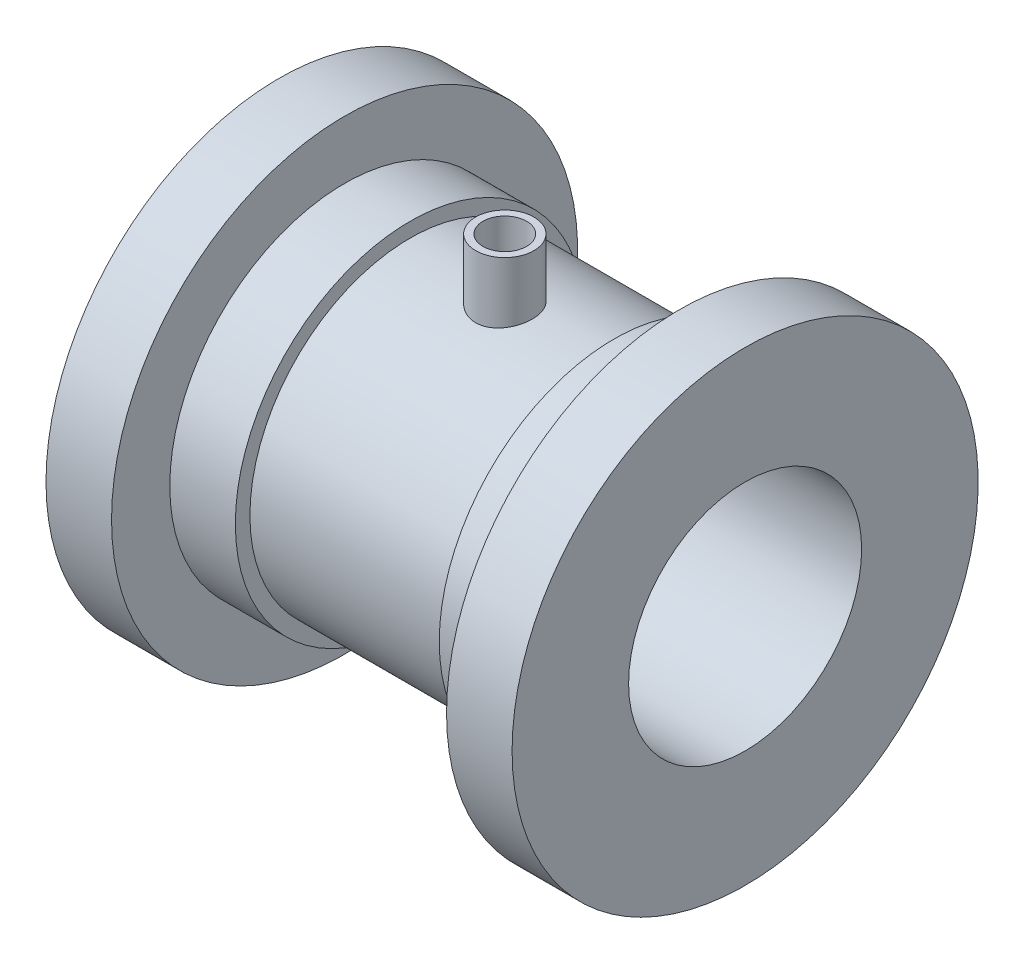
ISO-10303-21;
HEADER;
FILE_DESCRIPTION(('STEP AP214'),'2;1');
FILE_NAME('part.step','',(''),(''),'','','');
FILE_SCHEMA(('AUTOMOTIVE_DESIGN { 1 0 10303 214 1 1 1 1 }'));
ENDSEC;
DATA;
#1=APPLICATION_CONTEXT('core data for automotive mechanical design processes');
#2=APPLICATION_PROTOCOL_DEFINITION('international standard','automotive_design',2000,#1);
#3=PRODUCT_CONTEXT('',#1,'mechanical');
#4=PRODUCT('Part','Part','',(#3));
#5=PRODUCT_RELATED_PRODUCT_CATEGORY('part','',(#4));
#6=PRODUCT_DEFINITION_FORMATION('','',#4);
#7=PRODUCT_DEFINITION_CONTEXT('part definition',#1,'design');
#8=PRODUCT_DEFINITION('design','',#6,#7);
#9=PRODUCT_DEFINITION_SHAPE('','',#8);
#10=(LENGTH_UNIT() NAMED_UNIT(*) SI_UNIT(.MILLI.,.METRE.));
#11=(NAMED_UNIT(*) PLANE_ANGLE_UNIT() SI_UNIT($,.RADIAN.));
#12=(NAMED_UNIT(*) SI_UNIT($,.STERADIAN.) SOLID_ANGLE_UNIT());
#13=UNCERTAINTY_MEASURE_WITH_UNIT(LENGTH_MEASURE(1.E-05),#10,'distance_accuracy_value','');
#14=(GEOMETRIC_REPRESENTATION_CONTEXT(3) GLOBAL_UNCERTAINTY_ASSIGNED_CONTEXT((#13)) GLOBAL_UNIT_ASSIGNED_CONTEXT((#10,
#11,#12)) REPRESENTATION_CONTEXT('',''));
#15=CARTESIAN_POINT('',(0.,0.,0.));
#16=DIRECTION('',(0.,0.,1.));
#17=DIRECTION('',(1.,0.,0.));
#18=AXIS2_PLACEMENT_3D('',#15,#16,#17);
#19=CARTESIAN_POINT('',(0.,16.,0.));
#20=DIRECTION('',(1.,0.,0.));
#21=DIRECTION('',(0.,0.,-1.));
#22=AXIS2_PLACEMENT_3D('',#19,#20,#21);
#23=PLANE('',#22);
#24=CARTESIAN_POINT('',(0.,0.,0.));
#25=DIRECTION('',(-1.,0.,0.));
#26=DIRECTION('',(0.,0.,1.));
#27=AXIS2_PLACEMENT_3D('',#24,#25,#26);
#28=CIRCLE('',#27,16.);
#29=CARTESIAN_POINT('',(0.,0.,16.));
#30=VERTEX_POINT('',#29);
#31=EDGE_CURVE('E94',#30,#30,#28,.T.);
#32=ORIENTED_EDGE('',*,*,#31,.F.);
#33=EDGE_LOOP('',(#32));
#34=FACE_BOUND('',#33,.T.);
#35=CARTESIAN_POINT('',(0.,0.,0.));
#36=DIRECTION('',(-1.,0.,0.));
#37=DIRECTION('',(0.,0.,1.));
#38=AXIS2_PLACEMENT_3D('',#35,#36,#37);
#39=CIRCLE('',#38,32.);
#40=CARTESIAN_POINT('',(0.,0.,32.));
#41=VERTEX_POINT('',#40);
#42=EDGE_CURVE('E10',#41,#41,#39,.T.);
#43=ORIENTED_EDGE('',*,*,#42,.T.);
#44=EDGE_LOOP('',(#43));
#45=FACE_BOUND('',#44,.T.);
#46=ADVANCED_FACE('F43',(#34,#45),#23,.F.);
#47=CARTESIAN_POINT('',(0.,0.,0.));
#48=DIRECTION('',(-1.,0.,0.));
#49=DIRECTION('',(0.,0.,1.));
#50=AXIS2_PLACEMENT_3D('',#47,#48,#49);
#51=CYLINDRICAL_SURFACE('',#50,32.);
#52=ORIENTED_EDGE('',*,*,#42,.F.);
#53=EDGE_LOOP('',(#52));
#54=FACE_BOUND('',#53,.T.);
#55=CARTESIAN_POINT('',(9.,0.,0.));
#56=DIRECTION('',(-1.,0.,0.));
#57=DIRECTION('',(0.,0.,1.));
#58=AXIS2_PLACEMENT_3D('',#55,#56,#57);
#59=CIRCLE('',#58,32.);
#60=CARTESIAN_POINT('',(9.,0.,32.));
#61=VERTEX_POINT('',#60);
#62=EDGE_CURVE('E50',#61,#61,#59,.T.);
#63=ORIENTED_EDGE('',*,*,#62,.T.);
#64=EDGE_LOOP('',(#63));
#65=FACE_BOUND('',#64,.T.);
#66=ADVANCED_FACE('F183',(#54,#65),#51,.T.);
#67=CARTESIAN_POINT('',(9.,32.,0.));
#68=DIRECTION('',(-1.,0.,0.));
#69=DIRECTION('',(0.,0.,1.));
#70=AXIS2_PLACEMENT_3D('',#67,#68,#69);
#71=PLANE('',#70);
#72=ORIENTED_EDGE('',*,*,#62,.F.);
#73=EDGE_LOOP('',(#72));
#74=FACE_BOUND('',#73,.T.);
#75=CARTESIAN_POINT('',(9.,0.,0.));
#76=DIRECTION('',(-1.,0.,0.));
#77=DIRECTION('',(0.,0.,1.));
#78=AXIS2_PLACEMENT_3D('',#75,#76,#77);
#79=CIRCLE('',#78,24.);
#80=CARTESIAN_POINT('',(9.,0.,24.));
#81=VERTEX_POINT('',#80);
#82=EDGE_CURVE('E55',#81,#81,#79,.T.);
#83=ORIENTED_EDGE('',*,*,#82,.T.);
#84=EDGE_LOOP('',(#83));
#85=FACE_BOUND('',#84,.T.);
#86=ADVANCED_FACE('F180',(#74,#85),#71,.F.);
#87=CARTESIAN_POINT('',(0.,0.,0.));
#88=DIRECTION('',(-1.,0.,0.));
#89=DIRECTION('',(0.,0.,1.));
#90=AXIS2_PLACEMENT_3D('',#87,#88,#89);
#91=CYLINDRICAL_SURFACE('',#90,24.);
#92=ORIENTED_EDGE('',*,*,#82,.F.);
#93=EDGE_LOOP('',(#92));
#94=FACE_BOUND('',#93,.T.);
#95=CARTESIAN_POINT('',(18.,0.,0.));
#96=DIRECTION('',(-1.,0.,0.));
#97=DIRECTION('',(0.,0.,1.));
#98=AXIS2_PLACEMENT_3D('',#95,#96,#97);
#99=CIRCLE('',#98,24.);
#100=CARTESIAN_POINT('',(18.,0.,24.));
#101=VERTEX_POINT('',#100);
#102=EDGE_CURVE('E60',#101,#101,#99,.T.);
#103=ORIENTED_EDGE('',*,*,#102,.T.);
#104=EDGE_LOOP('',(#103));
#105=FACE_BOUND('',#104,.T.);
#106=ADVANCED_FACE('F176',(#94,#105),#91,.T.);
#107=CARTESIAN_POINT('',(18.,24.,0.));
#108=DIRECTION('',(-1.,0.,0.));
#109=DIRECTION('',(0.,0.,1.));
#110=AXIS2_PLACEMENT_3D('',#107,#108,#109);
#111=PLANE('',#110);
#112=ORIENTED_EDGE('',*,*,#102,.F.);
#113=EDGE_LOOP('',(#112));
#114=FACE_BOUND('',#113,.T.);
#115=CARTESIAN_POINT('',(18.,0.,0.));
#116=DIRECTION('',(-1.,0.,0.));
#117=DIRECTION('',(0.,0.,1.));
#118=AXIS2_PLACEMENT_3D('',#115,#116,#117);
#119=CIRCLE('',#118,22.);
#120=CARTESIAN_POINT('',(18.,0.,22.));
#121=VERTEX_POINT('',#120);
#122=EDGE_CURVE('E66',#121,#121,#119,.T.);
#123=ORIENTED_EDGE('',*,*,#122,.T.);
#124=EDGE_LOOP('',(#123));
#125=FACE_BOUND('',#124,.T.);
#126=ADVANCED_FACE('F172',(#114,#125),#111,.F.);
#127=CARTESIAN_POINT('',(0.,0.,0.));
#128=DIRECTION('',(-1.,0.,0.));
#129=DIRECTION('',(0.,0.,1.));
#130=AXIS2_PLACEMENT_3D('',#127,#128,#129);
#131=CYLINDRICAL_SURFACE('',#130,22.);
#132=CARTESIAN_POINT('',(32.,-21.6333076527839,4.));
#133=CARTESIAN_POINT('',(32.166865151293,-21.6333106072928,3.99999283357547));
#134=CARTESIAN_POINT('',(32.3338318375414,-21.6359052841705,3.9860291624718));
#135=CARTESIAN_POINT('',(32.6630869405694,-21.6460476263691,3.93057062437604));
#136=CARTESIAN_POINT('',(32.8253704124655,-21.6536003403845,3.88904769372796));
#137=CARTESIAN_POINT('',(33.1404227574065,-21.6729390371104,3.77978439515044));
#138=CARTESIAN_POINT('',(33.2932002427467,-21.6847211205625,3.71206817162694));
#139=CARTESIAN_POINT('',(33.5851841537289,-21.7114436684575,3.55242641612508));
#140=CARTESIAN_POINT('',(33.7243923868907,-21.7263837113955,3.46050411462151));
#141=CARTESIAN_POINT('',(33.9868680421346,-21.7582737597228,3.25399996836899));
#142=CARTESIAN_POINT('',(34.1099622651482,-21.7752423588633,3.13920086483257));
#143=CARTESIAN_POINT('',(34.3352475783716,-21.8096206431273,2.89070105057325));
#144=CARTESIAN_POINT('',(34.4374368260815,-21.8270303669785,2.7569986755291));
#145=CARTESIAN_POINT('',(34.6190563065532,-21.8610544255933,2.47284345197882));
#146=CARTESIAN_POINT('',(34.6982384421849,-21.8776585889646,2.32223066302686));
#147=CARTESIAN_POINT('',(34.8301042768304,-21.9085864769369,2.00959840045354));
#148=CARTESIAN_POINT('',(34.8827886694753,-21.9229102612246,1.84757922554355));
#149=CARTESIAN_POINT('',(34.9598741500161,-21.9482261625453,1.51744522483825));
#150=CARTESIAN_POINT('',(34.9843985443822,-21.9592326477665,1.34936032413048));
#151=CARTESIAN_POINT('',(35.0047544897381,-21.97739761424,1.01125849756624));
#152=CARTESIAN_POINT('',(35.0005880365605,-21.9845563631165,0.841241706919991));
#153=CARTESIAN_POINT('',(34.9638016697577,-21.9948123334617,0.506026628876224));
#154=CARTESIAN_POINT('',(34.9314846398022,-21.9979519135564,0.340796334159811));
#155=CARTESIAN_POINT('',(34.8396980855226,-22.0005849193392,0.0180303200496262));
#156=CARTESIAN_POINT('',(34.7802288892795,-22.0000783890824,-0.139505492291499));
#157=CARTESIAN_POINT('',(34.6360236480692,-21.996078747672,-0.44200736354264));
#158=CARTESIAN_POINT('',(34.5513528095413,-21.9925933010985,-0.587004630033434));
#159=CARTESIAN_POINT('',(34.3590852794332,-21.9835793445834,-0.860834950704227));
#160=CARTESIAN_POINT('',(34.2514877631834,-21.9780507611451,-0.989667423173771));
#161=CARTESIAN_POINT('',(34.0156922750297,-21.966012093024,-1.22829125993672));
#162=CARTESIAN_POINT('',(33.8873786322767,-21.9594965107271,-1.33796805581993));
#163=CARTESIAN_POINT('',(33.6141941121411,-21.9466543200522,-1.53429921061628));
#164=CARTESIAN_POINT('',(33.4693229249366,-21.9403277152131,-1.62095313862865));
#165=CARTESIAN_POINT('',(33.1665552154981,-21.928885531132,-1.76905119789611));
#166=CARTESIAN_POINT('',(33.0086157978229,-21.9237741721057,-1.83040800533576));
#167=CARTESIAN_POINT('',(32.6846233322212,-21.9156093439029,-1.92571406152135));
#168=CARTESIAN_POINT('',(32.5185704811604,-21.9125558248211,-1.95966397492295));
#169=CARTESIAN_POINT('',(32.1836040639106,-21.9089928991161,-1.99910696980314));
#170=CARTESIAN_POINT('',(32.0147007310278,-21.9084757852151,-2.00468626190624));
#171=CARTESIAN_POINT('',(31.6783622392783,-21.9100452575507,-1.98745773334384));
#172=CARTESIAN_POINT('',(31.5109270641129,-21.9121318148456,-1.96465022821733));
#173=CARTESIAN_POINT('',(31.1826468248341,-21.9185757427774,-1.89139373867598));
#174=CARTESIAN_POINT('',(31.0217883180321,-21.9229282029058,-1.84100451536613));
#175=CARTESIAN_POINT('',(30.710799476743,-21.933216774178,-1.71406901175159));
#176=CARTESIAN_POINT('',(30.5606694254854,-21.9391529271116,-1.63752204119505));
#177=CARTESIAN_POINT('',(30.274877124655,-21.9516712091953,-1.46014748994682));
#178=CARTESIAN_POINT('',(30.1392624278572,-21.9582553335854,-1.3592434293489));
#179=CARTESIAN_POINT('',(29.8868521801041,-21.9709285112839,-1.13611360774532));
#180=CARTESIAN_POINT('',(29.7700569119296,-21.9770175571525,-1.0138875264123));
#181=CARTESIAN_POINT('',(29.5583816290543,-21.9875610353851,-0.751283602788504));
#182=CARTESIAN_POINT('',(29.4635438615912,-21.9920123261652,-0.610871565771843));
#183=CARTESIAN_POINT('',(29.2987972003854,-21.998222928271,-0.316060078313533));
#184=CARTESIAN_POINT('',(29.2288873207437,-21.9999823460694,-0.16166118135575));
#185=CARTESIAN_POINT('',(29.1162928835552,-22.0000172879522,0.155915993876056));
#186=CARTESIAN_POINT('',(29.0734771218987,-21.9983097727662,0.319047748209399));
#187=CARTESIAN_POINT('',(29.0157431487911,-21.9910159515199,0.650087085198908));
#188=CARTESIAN_POINT('',(29.0008239669675,-21.9854297803867,0.817994501529115));
#189=CARTESIAN_POINT('',(28.9992461756646,-21.9704031326718,1.15298329884477));
#190=CARTESIAN_POINT('',(29.0124571637386,-21.9609806040265,1.32006490817425));
#191=CARTESIAN_POINT('',(29.0663967983138,-21.9386978169346,1.64948632694961));
#192=CARTESIAN_POINT('',(29.1071263209636,-21.9258374490403,1.81182598524724));
#193=CARTESIAN_POINT('',(29.2151412139472,-21.8974086518542,2.12811082377876));
#194=CARTESIAN_POINT('',(29.2825638324853,-21.8818264628619,2.28200786306558));
#195=CARTESIAN_POINT('',(29.4420137135294,-21.8491334484102,2.57629896657165));
#196=CARTESIAN_POINT('',(29.5340420691874,-21.832022555058,2.71669243049452));
#197=CARTESIAN_POINT('',(29.7412665977241,-21.7974351177578,2.98159027078914));
#198=CARTESIAN_POINT('',(29.8566980222536,-21.7799566204918,3.10591043658001));
#199=CARTESIAN_POINT('',(30.1069713663078,-21.7462937540672,3.33346285191935));
#200=CARTESIAN_POINT('',(30.2418176727932,-21.7301096786836,3.43669032260301));
#201=CARTESIAN_POINT('',(30.527415983346,-21.7004583769259,3.61921206326318));
#202=CARTESIAN_POINT('',(30.6781934913581,-21.6869956105425,3.69846714839078));
#203=CARTESIAN_POINT('',(30.9911295851972,-21.6640913479975,3.83036140667223));
#204=CARTESIAN_POINT('',(31.1532750910705,-21.6546453158644,3.88303061506473));
#205=CARTESIAN_POINT('',(31.4302242957192,-21.6429413434045,3.94762626781273));
#206=CARTESIAN_POINT('',(31.5432398194651,-21.6393441584583,3.96723621870755));
#207=CARTESIAN_POINT('',(31.7708209454786,-21.6345263184741,3.9934254363302));
#208=CARTESIAN_POINT('',(31.8853865216274,-21.6333056234414,4.000004922351));
#209=CARTESIAN_POINT('',(32.,-21.6333076527839,4.));
#210=B_SPLINE_CURVE_WITH_KNOTS('',3,(#132,#133,#134,#135,#136,#137,#138,#139,#140,#141,#142,
#143,#144,#145,#146,#147,#148,#149,#150,#151,#152,#153,#154,#155,#156,#157,#158,#159,#160,#161,
#162,#163,#164,#165,#166,#167,#168,#169,#170,#171,#172,#173,#174,#175,#176,#177,#178,#179,#180,
#181,#182,#183,#184,#185,#186,#187,#188,#189,#190,#191,#192,#193,#194,#195,#196,#197,#198,#199,
#200,#201,#202,#203,#204,#205,#206,#207,#208,#209),.UNSPECIFIED.,.T.,.F.,(4,2,2,2,2,2,2,2,2,2,2,
2,2,2,2,2,2,2,2,2,2,2,2,2,2,2,2,2,2,2,2,2,2,2,2,2,2,2,4),(0.,0.500174582549067,1.0008592770465,
1.50108354692276,2.0012410920847,2.50639674371891,3.01159689904925,3.52205825308928,
4.03250624409405,4.54071046758491,5.04887933902397,5.55164721947768,6.05440902512279,
6.55588113445157,7.05737128471267,7.56176509716519,8.06616834929206,8.572298474074,
9.07841632412102,9.58299529629833,10.0875686597798,10.5910530706543,11.0945507685251,
11.5996504702115,12.1047577608218,12.6108289710956,13.1168801640103,13.6204616478931,
14.1240256145485,14.6252603036577,15.1265109520754,15.63037307425,16.1342575850834,
16.6434835827137,17.1528248254776,17.6629941845681,18.1725858855561,18.5161430216387,
18.8596943758629),.UNSPECIFIED.);
#211=CARTESIAN_POINT('',(32.,-21.6333076527839,4.));
#212=VERTEX_POINT('',#211);
#213=EDGE_CURVE('E108',#212,#212,#210,.T.);
#214=ORIENTED_EDGE('',*,*,#213,.T.);
#215=EDGE_LOOP('',(#214));
#216=FACE_BOUND('',#215,.T.);
#217=CARTESIAN_POINT('',(32.,21.4242852856285,5.00000000000001));
#218=CARTESIAN_POINT('',(32.2213033900462,21.4242899965892,4.99999116124592));
#219=CARTESIAN_POINT('',(32.4427204642191,21.4286125092896,4.98156890483207));
#220=CARTESIAN_POINT('',(32.8792805312357,21.4454779451672,4.90844462426125));
#221=CARTESIAN_POINT('',(33.0944178523181,21.4580280732028,4.85371080184727));
#222=CARTESIAN_POINT('',(33.5119993036577,21.4900731095694,4.70979299573291));
#223=CARTESIAN_POINT('',(33.7144579702048,21.5095598869082,4.62064933622873));
#224=CARTESIAN_POINT('',(34.1015056440619,21.5536099212476,4.41059676192139));
#225=CARTESIAN_POINT('',(34.2860957152549,21.5781728757429,4.28968973987928));
#226=CARTESIAN_POINT('',(34.6354323771377,21.630545308581,4.01733595635763));
#227=CARTESIAN_POINT('',(34.7998201950866,21.6583998696942,3.8654377197882));
#228=CARTESIAN_POINT('',(35.1010055944069,21.7145438216702,3.53643741798592));
#229=CARTESIAN_POINT('',(35.2378001138395,21.7428332604156,3.35933255937094));
#230=CARTESIAN_POINT('',(35.4820044715122,21.7978579211239,2.98166249740763));
#231=CARTESIAN_POINT('',(35.5889232800789,21.8245620606925,2.78077476564201));
#232=CARTESIAN_POINT('',(35.7673329678758,21.8736990467,2.36334578160201));
#233=CARTESIAN_POINT('',(35.8388257846788,21.8961321266969,2.14680538616958));
#234=CARTESIAN_POINT('',(35.9436259442563,21.9348469595933,1.70615147445985));
#235=CARTESIAN_POINT('',(35.9772622937062,21.9511808748035,1.48212091185203));
#236=CARTESIAN_POINT('',(36.0062513433925,21.9769782142798,1.03121134840122));
#237=CARTESIAN_POINT('',(36.0016084161246,21.9864424231117,0.804332675842931));
#238=CARTESIAN_POINT('',(35.9544511351667,21.998193827224,0.358331458557684));
#239=CARTESIAN_POINT('',(35.9125912245051,22.0006019700514,0.139142630805288));
#240=CARTESIAN_POINT('',(35.7930678122133,21.9991420946456,-0.289216771353854));
#241=CARTESIAN_POINT('',(35.7154046157772,21.9952741299106,-0.498387431140608));
#242=CARTESIAN_POINT('',(35.5267330374777,21.9824875542563,-0.90035386893623));
#243=CARTESIAN_POINT('',(35.4157989095621,21.9735801515005,-1.09318489718192));
#244=CARTESIAN_POINT('',(35.1636609845016,21.9524132903994,-1.45771693690075));
#245=CARTESIAN_POINT('',(35.0224550486976,21.9401535952026,-1.62941645411368));
#246=CARTESIAN_POINT('',(34.7118957917905,21.9141039469765,-1.94886524847574));
#247=CARTESIAN_POINT('',(34.5422400304002,21.9002981467325,-2.09631927805707));
#248=CARTESIAN_POINT('',(34.1806239628788,21.8733694282765,-2.36081287957743));
#249=CARTESIAN_POINT('',(33.9886629369225,21.8602465321225,-2.47785146956874));
#250=CARTESIAN_POINT('',(33.5866256554339,21.8365404979391,-2.6787757338093));
#251=CARTESIAN_POINT('',(33.3764556890171,21.8259717060843,-2.76247577633498));
#252=CARTESIAN_POINT('',(32.9448733740774,21.8090120788966,-2.89333452575263));
#253=CARTESIAN_POINT('',(32.7234616615628,21.80262100749,-2.94049529742549));
#254=CARTESIAN_POINT('',(32.2773747722911,21.79497371403,-2.99665337403907));
#255=CARTESIAN_POINT('',(32.0527343067841,21.7936810587678,-3.00592147695924));
#256=CARTESIAN_POINT('',(31.6051035898031,21.7963154186519,-2.9867579920985));
#257=CARTESIAN_POINT('',(31.3821132938969,21.8002422927395,-2.95832742313068));
#258=CARTESIAN_POINT('',(30.9452373643139,21.8127202367032,-2.8648589697311));
#259=CARTESIAN_POINT('',(30.7313123607626,21.8212484788795,-2.80000173594139));
#260=CARTESIAN_POINT('',(30.3173579973674,21.8417009380334,-2.63569953197053));
#261=CARTESIAN_POINT('',(30.1173293486486,21.8536253286448,-2.53625279328535));
#262=CARTESIAN_POINT('',(29.7353779169675,21.8792482877524,-2.30479721338717));
#263=CARTESIAN_POINT('',(29.5535851723528,21.8929581885154,-2.17257504627136));
#264=CARTESIAN_POINT('',(29.2146440392436,21.9200540762599,-1.87957948065946));
#265=CARTESIAN_POINT('',(29.0574966799864,21.9334400496938,-1.7188048903584));
#266=CARTESIAN_POINT('',(28.7714262842041,21.9578575548323,-1.37214882465892));
#267=CARTESIAN_POINT('',(28.6426660127498,21.9688755001937,-1.18613196304996));
#268=CARTESIAN_POINT('',(28.4182252673525,21.9865045506566,-0.794919427526795));
#269=CARTESIAN_POINT('',(28.3225427336649,21.993115930178,-0.589724948810532));
#270=CARTESIAN_POINT('',(28.1676942464617,22.0003641718882,-0.167712725640372));
#271=CARTESIAN_POINT('',(28.1082479907396,22.0010474500483,0.0490013251846842));
#272=CARTESIAN_POINT('',(28.0264338343863,21.9956604712793,0.489229196065801));
#273=CARTESIAN_POINT('',(28.0040632040038,21.9895907116081,0.712742514281036));
#274=CARTESIAN_POINT('',(27.9969842628512,21.9706314849219,1.15778398064215));
#275=CARTESIAN_POINT('',(28.011895733236,21.9578119100906,1.37930923413823));
#276=CARTESIAN_POINT('',(28.0779695698053,21.9259813724032,1.81642028233446));
#277=CARTESIAN_POINT('',(28.1291331559369,21.9069702012007,2.03200587690106));
#278=CARTESIAN_POINT('',(28.2664761278245,21.8638917182105,2.45259541881222));
#279=CARTESIAN_POINT('',(28.3528610409404,21.8397951365635,2.65752915702863));
#280=CARTESIAN_POINT('',(28.5581148202815,21.788454494654,3.04999518708318));
#281=CARTESIAN_POINT('',(28.6769867436398,21.761210138315,3.23752583900845));
#282=CARTESIAN_POINT('',(28.9463565587727,21.7053042089106,3.59344349486357));
#283=CARTESIAN_POINT('',(29.0973784331578,21.6766260627122,3.76143154572639));
#284=CARTESIAN_POINT('',(29.4257001232982,21.6208532897971,4.06980601601971));
#285=CARTESIAN_POINT('',(29.6030059659203,21.5937590282543,4.21018608776794));
#286=CARTESIAN_POINT('',(29.9801592974353,21.5435522825244,4.46001425037352));
#287=CARTESIAN_POINT('',(30.1801254001009,21.5204625173442,4.56928797164652));
#288=CARTESIAN_POINT('',(30.5961158081491,21.4807676534827,4.75241807507879));
#289=CARTESIAN_POINT('',(30.8121230916081,21.4641557946587,4.82631139758054));
#290=CARTESIAN_POINT('',(31.1907815161585,21.4426803381134,4.92067368424786));
#291=CARTESIAN_POINT('',(31.3510830076984,21.4358174267507,4.95036837844796));
#292=CARTESIAN_POINT('',(31.6742358598553,21.4266182500746,4.99003442558308));
#293=CARTESIAN_POINT('',(31.8370871261123,21.4242818176467,5.00000650666414));
#294=CARTESIAN_POINT('',(32.,21.4242852856285,5.00000000000001));
#295=B_SPLINE_CURVE_WITH_KNOTS('',3,(#217,#218,#219,#220,#221,#222,#223,#224,#225,#226,#227,
#228,#229,#230,#231,#232,#233,#234,#235,#236,#237,#238,#239,#240,#241,#242,#243,#244,#245,#246,
#247,#248,#249,#250,#251,#252,#253,#254,#255,#256,#257,#258,#259,#260,#261,#262,#263,#264,#265,
#266,#267,#268,#269,#270,#271,#272,#273,#274,#275,#276,#277,#278,#279,#280,#281,#282,#283,#284,
#285,#286,#287,#288,#289,#290,#291,#292,#293,#294),.UNSPECIFIED.,.T.,.F.,(4,2,2,2,2,2,2,2,2,2,2,
2,2,2,2,2,2,2,2,2,2,2,2,2,2,2,2,2,2,2,2,2,2,2,2,2,2,2,4),(0.,0.663310200090314,1.32720203300572,
1.99031821488088,2.65339489099244,3.32692660213547,4.00053301184401,4.68463443626383,
5.36869844062805,6.04677026453819,6.72476463596642,7.39106753783926,8.05736476012346,
8.72218587044252,9.38705396489092,10.0594991877075,10.7319661173961,11.408126738953,
12.0842491488722,12.7555311484808,13.4267950069478,14.0947588959621,14.7627569418837,
15.4352225319688,16.1077161979994,16.7839709103844,17.4601835049222,18.1310966512494,
18.8019603983467,19.4660103532371,20.1300826556314,20.798086785692,21.46615379877,
22.146080799287,22.8261639476943,23.5099874946216,24.1930955024176,24.6814104836984,
25.1697074363711),.UNSPECIFIED.);
#296=CARTESIAN_POINT('',(32.,21.4242852856285,5.00000000000001));
#297=VERTEX_POINT('',#296);
#298=EDGE_CURVE('E99',#297,#297,#295,.T.);
#299=ORIENTED_EDGE('',*,*,#298,.F.);
#300=EDGE_LOOP('',(#299));
#301=FACE_BOUND('',#300,.T.);
#302=ORIENTED_EDGE('',*,*,#122,.F.);
#303=EDGE_LOOP('',(#302));
#304=FACE_BOUND('',#303,.T.);
#305=CARTESIAN_POINT('',(46.,0.,0.));
#306=DIRECTION('',(-1.,0.,0.));
#307=DIRECTION('',(0.,0.,1.));
#308=AXIS2_PLACEMENT_3D('',#305,#306,#307);
#309=CIRCLE('',#308,22.);
#310=CARTESIAN_POINT('',(46.,0.,22.));
#311=VERTEX_POINT('',#310);
#312=EDGE_CURVE('E70',#311,#311,#309,.T.);
#313=ORIENTED_EDGE('',*,*,#312,.T.);
#314=EDGE_LOOP('',(#313));
#315=FACE_BOUND('',#314,.T.);
#316=ADVANCED_FACE('F167',(#216,#301,#304,#315),#131,.T.);
#317=CARTESIAN_POINT('',(46.,24.,0.));
#318=DIRECTION('',(1.,0.,0.));
#319=DIRECTION('',(0.,0.,-1.));
#320=AXIS2_PLACEMENT_3D('',#317,#318,#319);
#321=PLANE('',#320);
#322=ORIENTED_EDGE('',*,*,#312,.F.);
#323=EDGE_LOOP('',(#322));
#324=FACE_BOUND('',#323,.T.);
#325=CARTESIAN_POINT('',(46.,0.,0.));
#326=DIRECTION('',(-1.,0.,0.));
#327=DIRECTION('',(0.,0.,1.));
#328=AXIS2_PLACEMENT_3D('',#325,#326,#327);
#329=CIRCLE('',#328,24.);
#330=CARTESIAN_POINT('',(46.,0.,24.));
#331=VERTEX_POINT('',#330);
#332=EDGE_CURVE('E74',#331,#331,#329,.T.);
#333=ORIENTED_EDGE('',*,*,#332,.T.);
#334=EDGE_LOOP('',(#333));
#335=FACE_BOUND('',#334,.T.);
#336=ADVANCED_FACE('F164',(#324,#335),#321,.F.);
#337=CARTESIAN_POINT('',(0.,0.,0.));
#338=DIRECTION('',(-1.,0.,0.));
#339=DIRECTION('',(0.,0.,1.));
#340=AXIS2_PLACEMENT_3D('',#337,#338,#339);
#341=CYLINDRICAL_SURFACE('',#340,24.);
#342=ORIENTED_EDGE('',*,*,#332,.F.);
#343=EDGE_LOOP('',(#342));
#344=FACE_BOUND('',#343,.T.);
#345=CARTESIAN_POINT('',(55.,0.,0.));
#346=DIRECTION('',(-1.,0.,0.));
#347=DIRECTION('',(0.,0.,1.));
#348=AXIS2_PLACEMENT_3D('',#345,#346,#347);
#349=CIRCLE('',#348,24.);
#350=CARTESIAN_POINT('',(55.,0.,24.));
#351=VERTEX_POINT('',#350);
#352=EDGE_CURVE('E78',#351,#351,#349,.T.);
#353=ORIENTED_EDGE('',*,*,#352,.T.);
#354=EDGE_LOOP('',(#353));
#355=FACE_BOUND('',#354,.T.);
#356=ADVANCED_FACE('F160',(#344,#355),#341,.T.);
#357=CARTESIAN_POINT('',(55.,32.,0.));
#358=DIRECTION('',(1.,0.,0.));
#359=DIRECTION('',(0.,0.,-1.));
#360=AXIS2_PLACEMENT_3D('',#357,#358,#359);
#361=PLANE('',#360);
#362=ORIENTED_EDGE('',*,*,#352,.F.);
#363=EDGE_LOOP('',(#362));
#364=FACE_BOUND('',#363,.T.);
#365=CARTESIAN_POINT('',(55.,0.,0.));
#366=DIRECTION('',(-1.,0.,0.));
#367=DIRECTION('',(0.,0.,1.));
#368=AXIS2_PLACEMENT_3D('',#365,#366,#367);
#369=CIRCLE('',#368,32.);
#370=CARTESIAN_POINT('',(55.,0.,32.));
#371=VERTEX_POINT('',#370);
#372=EDGE_CURVE('E82',#371,#371,#369,.T.);
#373=ORIENTED_EDGE('',*,*,#372,.T.);
#374=EDGE_LOOP('',(#373));
#375=FACE_BOUND('',#374,.T.);
#376=ADVANCED_FACE('F156',(#364,#375),#361,.F.);
#377=CARTESIAN_POINT('',(0.,0.,0.));
#378=DIRECTION('',(-1.,0.,0.));
#379=DIRECTION('',(0.,0.,1.));
#380=AXIS2_PLACEMENT_3D('',#377,#378,#379);
#381=CYLINDRICAL_SURFACE('',#380,32.);
#382=ORIENTED_EDGE('',*,*,#372,.F.);
#383=EDGE_LOOP('',(#382));
#384=FACE_BOUND('',#383,.T.);
#385=CARTESIAN_POINT('',(64.,0.,0.));
#386=DIRECTION('',(-1.,0.,0.));
#387=DIRECTION('',(0.,0.,1.));
#388=AXIS2_PLACEMENT_3D('',#385,#386,#387);
#389=CIRCLE('',#388,32.);
#390=CARTESIAN_POINT('',(64.,0.,32.));
#391=VERTEX_POINT('',#390);
#392=EDGE_CURVE('E86',#391,#391,#389,.T.);
#393=ORIENTED_EDGE('',*,*,#392,.T.);
#394=EDGE_LOOP('',(#393));
#395=FACE_BOUND('',#394,.T.);
#396=ADVANCED_FACE('F152',(#384,#395),#381,.T.);
#397=CARTESIAN_POINT('',(64.,16.,0.));
#398=DIRECTION('',(-1.,0.,0.));
#399=DIRECTION('',(0.,0.,1.));
#400=AXIS2_PLACEMENT_3D('',#397,#398,#399);
#401=PLANE('',#400);
#402=ORIENTED_EDGE('',*,*,#392,.F.);
#403=EDGE_LOOP('',(#402));
#404=FACE_BOUND('',#403,.T.);
#405=CARTESIAN_POINT('',(64.,0.,0.));
#406=DIRECTION('',(-1.,0.,0.));
#407=DIRECTION('',(0.,0.,1.));
#408=AXIS2_PLACEMENT_3D('',#405,#406,#407);
#409=CIRCLE('',#408,16.);
#410=CARTESIAN_POINT('',(64.,0.,16.));
#411=VERTEX_POINT('',#410);
#412=EDGE_CURVE('E90',#411,#411,#409,.T.);
#413=ORIENTED_EDGE('',*,*,#412,.T.);
#414=EDGE_LOOP('',(#413));
#415=FACE_BOUND('',#414,.T.);
#416=ADVANCED_FACE('F147',(#404,#415),#401,.F.);
#417=CARTESIAN_POINT('',(0.,0.,0.));
#418=DIRECTION('',(-1.,0.,0.));
#419=DIRECTION('',(0.,0.,1.));
#420=AXIS2_PLACEMENT_3D('',#417,#418,#419);
#421=CYLINDRICAL_SURFACE('',#420,16.);
#422=CARTESIAN_POINT('',(32.,-15.4919333848297,4.));
#423=CARTESIAN_POINT('',(31.8346147851679,-15.4919371031014,3.99999341527523));
#424=CARTESIAN_POINT('',(31.6691467651857,-15.4954973997223,3.98627404090673));
#425=CARTESIAN_POINT('',(31.3429200139728,-15.5093987419322,3.93183275245756));
#426=CARTESIAN_POINT('',(31.1821654542321,-15.5197456151402,3.89108763108606));
#427=CARTESIAN_POINT('',(30.870175910389,-15.546200715636,3.78400055303452));
#428=CARTESIAN_POINT('',(30.7189286601706,-15.5623013323979,3.71769239970984));
#429=CARTESIAN_POINT('',(30.4297447807222,-15.5987844820149,3.56150610504222));
#430=CARTESIAN_POINT('',(30.291807644554,-15.6191668516982,3.47162886185302));
#431=CARTESIAN_POINT('',(30.030244850027,-15.6628588874522,3.26891030884136));
#432=CARTESIAN_POINT('',(29.9069380903379,-15.6862165034845,3.15566794625502));
#433=CARTESIAN_POINT('',(29.6808702352191,-15.7335755510729,2.91035770906913));
#434=CARTESIAN_POINT('',(29.5781118955412,-15.7575770684941,2.77828731350198));
#435=CARTESIAN_POINT('',(29.3940141796833,-15.8047841438671,2.49592935850082));
#436=CARTESIAN_POINT('',(29.313148070975,-15.8279639213108,2.34532837039821));
#437=CARTESIAN_POINT('',(29.1780118325436,-15.871202824645,2.03220833636726));
#438=CARTESIAN_POINT('',(29.1237404755414,-15.8912620945097,1.86968984079913));
#439=CARTESIAN_POINT('',(29.0438843331804,-15.9267087534941,1.53864305938615));
#440=CARTESIAN_POINT('',(29.0180731397016,-15.9421322946926,1.37017337345595));
#441=CARTESIAN_POINT('',(28.9953469909066,-15.9676598852546,1.03090201835769));
#442=CARTESIAN_POINT('',(28.9984282008572,-15.9777646403639,0.860100661664492));
#443=CARTESIAN_POINT('',(29.033196325867,-15.9922590977852,0.524671162522637));
#444=CARTESIAN_POINT('',(29.0643078032941,-15.9967594457474,0.359987925190114));
#445=CARTESIAN_POINT('',(29.1535057890783,-16.0007650713164,0.0380381837803776));
#446=CARTESIAN_POINT('',(29.2115916116174,-16.0002704759121,-0.119228508749207));
#447=CARTESIAN_POINT('',(29.3526987699163,-15.9951680973474,-0.421059201914345));
#448=CARTESIAN_POINT('',(29.4355887618072,-15.9905817336425,-0.565685051095385));
#449=CARTESIAN_POINT('',(29.6240689959794,-15.9785657416887,-0.839167152788255));
#450=CARTESIAN_POINT('',(29.7296607081706,-15.9711359293055,-0.968022383322637));
#451=CARTESIAN_POINT('',(29.9618641366076,-15.9548101407328,-1.20774640282481));
#452=CARTESIAN_POINT('',(30.0886881416169,-15.9458993645827,-1.31840857679885));
#453=CARTESIAN_POINT('',(30.3590385649121,-15.928233621995,-1.51701844143276));
#454=CARTESIAN_POINT('',(30.5025656330016,-15.9194786616346,-1.60496524796186));
#455=CARTESIAN_POINT('',(30.803392184652,-15.9035089497704,-1.75620421229805));
#456=CARTESIAN_POINT('',(30.9607789231833,-15.8963051101106,-1.81932412846988));
#457=CARTESIAN_POINT('',(31.2840202515765,-15.8846775179312,-1.91820757630837));
#458=CARTESIAN_POINT('',(31.4498744533258,-15.8802536381135,-1.95397236061965));
#459=CARTESIAN_POINT('',(31.7843677102119,-15.8749053164789,-1.9969616672857));
#460=CARTESIAN_POINT('',(31.9529863866829,-15.8739617279857,-2.00434235317723));
#461=CARTESIAN_POINT('',(32.2890580542751,-15.875668964695,-1.99077353299556));
#462=CARTESIAN_POINT('',(32.4565110719514,-15.8783197077431,-1.96982467444068));
#463=CARTESIAN_POINT('',(32.7847416837407,-15.886779427507,-1.90037908005262));
#464=CARTESIAN_POINT('',(32.945545401189,-15.8925744607359,-1.85200392506271));
#465=CARTESIAN_POINT('',(33.2567723419035,-15.9064035824573,-1.72919635433485));
#466=CARTESIAN_POINT('',(33.4071950669233,-15.9144377783275,-1.65476268893201));
#467=CARTESIAN_POINT('',(33.6943497617302,-15.9315090398298,-1.48142467371182));
#468=CARTESIAN_POINT('',(33.8309969201546,-15.9405516721456,-1.38238037074741));
#469=CARTESIAN_POINT('',(34.085812187259,-15.9580703902232,-1.16279359909557));
#470=CARTESIAN_POINT('',(34.2039797164051,-15.9665464582124,-1.04225045644356));
#471=CARTESIAN_POINT('',(34.418948620843,-15.9813857537833,-0.782476202462185));
#472=CARTESIAN_POINT('',(34.5156629944355,-15.9877404289464,-0.643172548889448));
#473=CARTESIAN_POINT('',(34.6843156072097,-15.9968375705089,-0.350190533518231));
#474=CARTESIAN_POINT('',(34.7562556244027,-15.9995802961715,-0.196513204299702));
#475=CARTESIAN_POINT('',(34.8727308755813,-16.000326760327,0.119372572953285));
#476=CARTESIAN_POINT('',(34.9175019309336,-15.9983720308414,0.281493947355671));
#477=CARTESIAN_POINT('',(34.9793573460561,-15.9891855830301,0.61078286166411));
#478=CARTESIAN_POINT('',(34.9964435909883,-15.9819542240584,0.777950057191704));
#479=CARTESIAN_POINT('',(35.002527926431,-15.962247982444,1.11095110028661));
#480=CARTESIAN_POINT('',(34.9917791530606,-15.949821211299,1.27678330264142));
#481=CARTESIAN_POINT('',(34.9432208213602,-15.920244687487,1.60399777359247));
#482=CARTESIAN_POINT('',(34.9054099277763,-15.9030947018007,1.76537982220861));
#483=CARTESIAN_POINT('',(34.8035200053832,-15.8649307653918,2.0807299227759));
#484=CARTESIAN_POINT('',(34.7392117191111,-15.8438839971496,2.23461982293644));
#485=CARTESIAN_POINT('',(34.5862156512683,-15.7995052738804,2.52940320964953));
#486=CARTESIAN_POINT('',(34.4975251108244,-15.7761730604457,2.67029522306899));
#487=CARTESIAN_POINT('',(34.2961368522985,-15.7285161928533,2.93814157720199));
#488=CARTESIAN_POINT('',(34.1829903592156,-15.7041810118222,3.06475686879953));
#489=CARTESIAN_POINT('',(33.9367900686794,-15.6570119395519,3.29728499550082));
#490=CARTESIAN_POINT('',(33.8037317408472,-15.6341783916733,3.40319310658602));
#491=CARTESIAN_POINT('',(33.5206091670976,-15.5919604910427,3.5916800819224));
#492=CARTESIAN_POINT('',(33.3704701399304,-15.5725923416496,3.67415036102024));
#493=CARTESIAN_POINT('',(33.05793683901,-15.5393143555389,3.81245511552344));
#494=CARTESIAN_POINT('',(32.8955558785405,-15.525398688423,3.86831805630461));
#495=CARTESIAN_POINT('',(32.6104765905189,-15.5073826918571,3.93979653158393));
#496=CARTESIAN_POINT('',(32.4895715462323,-15.501618427858,3.96233112784775));
#497=CARTESIAN_POINT('',(32.2457928540742,-15.4938924804561,3.99243496318869));
#498=CARTESIAN_POINT('',(32.1229192974565,-15.4919306212976,4.00000489396675));
#499=CARTESIAN_POINT('',(32.,-15.4919333848297,4.));
#500=B_SPLINE_CURVE_WITH_KNOTS('',3,(#422,#423,#424,#425,#426,#427,#428,#429,#430,#431,#432,
#433,#434,#435,#436,#437,#438,#439,#440,#441,#442,#443,#444,#445,#446,#447,#448,#449,#450,#451,
#452,#453,#454,#455,#456,#457,#458,#459,#460,#461,#462,#463,#464,#465,#466,#467,#468,#469,#470,
#471,#472,#473,#474,#475,#476,#477,#478,#479,#480,#481,#482,#483,#484,#485,#486,#487,#488,#489,
#490,#491,#492,#493,#494,#495,#496,#497,#498,#499),.UNSPECIFIED.,.T.,.F.,(4,2,2,2,2,2,2,2,2,2,2,
2,2,2,2,2,2,2,2,2,2,2,2,2,2,2,2,2,2,2,2,2,2,2,2,2,2,2,4),(0.,0.495701453501358,
0.991829123042688,1.48730297454235,1.98275794762765,2.4875551706745,2.99242004681854,
3.50745702500825,4.02247023333132,4.53335613562844,5.04417423174744,5.54473878617775,
6.04529061453908,6.54323744574949,7.04121652815439,7.54450975906881,8.04782257628325,
8.55456810982642,9.06129043711787,9.5652208591257,10.0691397631698,10.5708420670433,
11.0725684339061,11.5772160175245,12.0818794240619,12.5885534855571,13.0951911763815,
13.5973659913975,14.0995066100194,14.5970967511165,15.0947114451675,15.5967250900968,
16.0987955617029,16.6110083312914,17.1233378181952,17.6380035608121,18.1521174539999,
18.5205548082874,18.8889751321623),.UNSPECIFIED.);
#501=CARTESIAN_POINT('',(32.,-15.4919333848297,4.));
#502=VERTEX_POINT('',#501);
#503=EDGE_CURVE('E134',#502,#502,#500,.T.);
#504=ORIENTED_EDGE('',*,*,#503,.T.);
#505=EDGE_LOOP('',(#504));
#506=FACE_BOUND('',#505,.T.);
#507=CARTESIAN_POINT('',(32.,15.4919333848297,4.));
#508=CARTESIAN_POINT('',(32.1653852148321,15.4919371031014,3.99999341527523));
#509=CARTESIAN_POINT('',(32.3308532348143,15.4954973997223,3.98627404090673));
#510=CARTESIAN_POINT('',(32.6570799860272,15.5093987419322,3.93183275245756));
#511=CARTESIAN_POINT('',(32.8178345457679,15.5197456151402,3.89108763108606));
#512=CARTESIAN_POINT('',(33.129824089611,15.546200715636,3.78400055303452));
#513=CARTESIAN_POINT('',(33.2810713398294,15.5623013323979,3.71769239970984));
#514=CARTESIAN_POINT('',(33.5702552192778,15.5987844820149,3.56150610504222));
#515=CARTESIAN_POINT('',(33.708192355446,15.6191668516982,3.47162886185302));
#516=CARTESIAN_POINT('',(33.969755149973,15.6628588874522,3.26891030884136));
#517=CARTESIAN_POINT('',(34.0930619096621,15.6862165034845,3.15566794625502));
#518=CARTESIAN_POINT('',(34.3191297647809,15.7335755510729,2.91035770906913));
#519=CARTESIAN_POINT('',(34.4218881044588,15.7575770684941,2.77828731350198));
#520=CARTESIAN_POINT('',(34.6059858203167,15.8047841438671,2.49592935850082));
#521=CARTESIAN_POINT('',(34.686851929025,15.8279639213108,2.34532837039821));
#522=CARTESIAN_POINT('',(34.8219881674564,15.871202824645,2.03220833636726));
#523=CARTESIAN_POINT('',(34.8762595244586,15.8912620945097,1.86968984079913));
#524=CARTESIAN_POINT('',(34.9561156668196,15.9267087534941,1.53864305938615));
#525=CARTESIAN_POINT('',(34.9819268602984,15.9421322946926,1.37017337345595));
#526=CARTESIAN_POINT('',(35.0046530090934,15.9676598852546,1.03090201835769));
#527=CARTESIAN_POINT('',(35.0015717991428,15.9777646403639,0.860100661664488));
#528=CARTESIAN_POINT('',(34.966803674133,15.9922590977852,0.524671162522633));
#529=CARTESIAN_POINT('',(34.9356921967059,15.9967594457474,0.35998792519011));
#530=CARTESIAN_POINT('',(34.8464942109217,16.0007650713164,0.0380381837803742));
#531=CARTESIAN_POINT('',(34.7884083883826,16.0002704759121,-0.11922850874921));
#532=CARTESIAN_POINT('',(34.6473012300837,15.9951680973474,-0.421059201914348));
#533=CARTESIAN_POINT('',(34.5644112381928,15.9905817336425,-0.565685051095387));
#534=CARTESIAN_POINT('',(34.3759310040206,15.9785657416887,-0.839167152788257));
#535=CARTESIAN_POINT('',(34.2703392918294,15.9711359293055,-0.968022383322638));
#536=CARTESIAN_POINT('',(34.0381358633924,15.9548101407328,-1.20774640282481));
#537=CARTESIAN_POINT('',(33.9113118583831,15.9458993645827,-1.31840857679885));
#538=CARTESIAN_POINT('',(33.6409614350879,15.928233621995,-1.51701844143277));
#539=CARTESIAN_POINT('',(33.4974343669984,15.9194786616346,-1.60496524796187));
#540=CARTESIAN_POINT('',(33.196607815348,15.9035089497704,-1.75620421229806));
#541=CARTESIAN_POINT('',(33.0392210768167,15.8963051101106,-1.81932412846988));
#542=CARTESIAN_POINT('',(32.7159797484235,15.8846775179312,-1.91820757630837));
#543=CARTESIAN_POINT('',(32.5501255466742,15.8802536381135,-1.95397236061965));
#544=CARTESIAN_POINT('',(32.2156322897881,15.8749053164789,-1.9969616672857));
#545=CARTESIAN_POINT('',(32.0470136133171,15.8739617279857,-2.00434235317723));
#546=CARTESIAN_POINT('',(31.7109419457249,15.875668964695,-1.99077353299556));
#547=CARTESIAN_POINT('',(31.5434889280486,15.8783197077431,-1.96982467444068));
#548=CARTESIAN_POINT('',(31.2152583162593,15.886779427507,-1.90037908005262));
#549=CARTESIAN_POINT('',(31.054454598811,15.8925744607359,-1.85200392506271));
#550=CARTESIAN_POINT('',(30.7432276580965,15.9064035824573,-1.72919635433485));
#551=CARTESIAN_POINT('',(30.5928049330767,15.9144377783275,-1.65476268893201));
#552=CARTESIAN_POINT('',(30.3056502382698,15.9315090398298,-1.48142467371182));
#553=CARTESIAN_POINT('',(30.1690030798453,15.9405516721456,-1.38238037074741));
#554=CARTESIAN_POINT('',(29.914187812741,15.9580703902232,-1.16279359909557));
#555=CARTESIAN_POINT('',(29.7960202835949,15.9665464582124,-1.04225045644356));
#556=CARTESIAN_POINT('',(29.581051379157,15.9813857537833,-0.782476202462185));
#557=CARTESIAN_POINT('',(29.4843370055645,15.9877404289464,-0.64317254888945));
#558=CARTESIAN_POINT('',(29.3156843927903,15.9968375705089,-0.350190533518234));
#559=CARTESIAN_POINT('',(29.2437443755973,15.9995802961715,-0.196513204299703));
#560=CARTESIAN_POINT('',(29.1272691244187,16.000326760327,0.119372572953286));
#561=CARTESIAN_POINT('',(29.0824980690664,15.9983720308414,0.281493947355672));
#562=CARTESIAN_POINT('',(29.0206426539439,15.9891855830301,0.610782861664113));
#563=CARTESIAN_POINT('',(29.0035564090117,15.9819542240584,0.777950057191707));
#564=CARTESIAN_POINT('',(28.997472073569,15.962247982444,1.11095110028661));
#565=CARTESIAN_POINT('',(29.0082208469394,15.949821211299,1.27678330264142));
#566=CARTESIAN_POINT('',(29.0567791786398,15.920244687487,1.60399777359247));
#567=CARTESIAN_POINT('',(29.0945900722237,15.9030947018007,1.76537982220862));
#568=CARTESIAN_POINT('',(29.1964799946168,15.8649307653918,2.0807299227759));
#569=CARTESIAN_POINT('',(29.2607882808889,15.8438839971496,2.23461982293644));
#570=CARTESIAN_POINT('',(29.4137843487317,15.7995052738804,2.52940320964953));
#571=CARTESIAN_POINT('',(29.5024748891756,15.7761730604457,2.670295223069));
#572=CARTESIAN_POINT('',(29.7038631477015,15.7285161928533,2.93814157720199));
#573=CARTESIAN_POINT('',(29.8170096407844,15.7041810118222,3.06475686879953));
#574=CARTESIAN_POINT('',(30.0632099313206,15.6570119395519,3.29728499550082));
#575=CARTESIAN_POINT('',(30.1962682591528,15.6341783916733,3.40319310658602));
#576=CARTESIAN_POINT('',(30.4793908329024,15.5919604910427,3.5916800819224));
#577=CARTESIAN_POINT('',(30.6295298600696,15.5725923416496,3.67415036102024));
#578=CARTESIAN_POINT('',(30.94206316099,15.5393143555389,3.81245511552344));
#579=CARTESIAN_POINT('',(31.1044441214595,15.525398688423,3.86831805630461));
#580=CARTESIAN_POINT('',(31.3895234094811,15.5073826918571,3.93979653158393));
#581=CARTESIAN_POINT('',(31.5104284537677,15.501618427858,3.96233112784775));
#582=CARTESIAN_POINT('',(31.7542071459258,15.4938924804561,3.99243496318869));
#583=CARTESIAN_POINT('',(31.8770807025435,15.4919306212976,4.00000489396675));
#584=CARTESIAN_POINT('',(32.,15.4919333848297,4.));
#585=B_SPLINE_CURVE_WITH_KNOTS('',3,(#507,#508,#509,#510,#511,#512,#513,#514,#515,#516,#517,
#518,#519,#520,#521,#522,#523,#524,#525,#526,#527,#528,#529,#530,#531,#532,#533,#534,#535,#536,
#537,#538,#539,#540,#541,#542,#543,#544,#545,#546,#547,#548,#549,#550,#551,#552,#553,#554,#555,
#556,#557,#558,#559,#560,#561,#562,#563,#564,#565,#566,#567,#568,#569,#570,#571,#572,#573,#574,
#575,#576,#577,#578,#579,#580,#581,#582,#583,#584),.UNSPECIFIED.,.T.,.F.,(4,2,2,2,2,2,2,2,2,2,2,
2,2,2,2,2,2,2,2,2,2,2,2,2,2,2,2,2,2,2,2,2,2,2,2,2,2,2,4),(0.,0.495701453501358,
0.991829123042692,1.48730297454236,1.98275794762764,2.48755517067449,2.99242004681854,
3.50745702500825,4.02247023333132,4.53335613562845,5.04417423174745,5.54473878617776,
6.04529061453909,6.54323744574949,7.04121652815439,7.54450975906882,8.04782257628325,
8.55456810982643,9.06129043711787,9.5652208591257,10.0691397631698,10.5708420670433,
11.0725684339061,11.5772160175245,12.0818794240619,12.5885534855571,13.0951911763815,
13.5973659913975,14.0995066100194,14.5970967511165,15.0947114451675,15.5967250900968,
16.0987955617029,16.6110083312914,17.1233378181952,17.6380035608121,18.1521174539999,
18.5205548082874,18.8889751321623),.UNSPECIFIED.);
#586=CARTESIAN_POINT('',(32.,15.4919333848297,4.));
#587=VERTEX_POINT('',#586);
#588=EDGE_CURVE('E128',#587,#587,#585,.T.);
#589=ORIENTED_EDGE('',*,*,#588,.T.);
#590=EDGE_LOOP('',(#589));
#591=FACE_BOUND('',#590,.T.);
#592=ORIENTED_EDGE('',*,*,#412,.F.);
#593=EDGE_LOOP('',(#592));
#594=FACE_BOUND('',#593,.T.);
#595=ORIENTED_EDGE('',*,*,#31,.T.);
#596=EDGE_LOOP('',(#595));
#597=FACE_BOUND('',#596,.T.);
#598=ADVANCED_FACE('F118',(#506,#591,#594,#597),#421,.F.);
#599=CARTESIAN_POINT('',(32.,30.,1.));
#600=DIRECTION('',(0.,1.,0.));
#601=DIRECTION('',(0.,0.,1.));
#602=AXIS2_PLACEMENT_3D('',#599,#600,#601);
#603=PLANE('',#602);
#604=CARTESIAN_POINT('',(32.,30.,1.));
#605=DIRECTION('',(0.,1.,0.));
#606=DIRECTION('',(0.,0.,1.));
#607=AXIS2_PLACEMENT_3D('',#604,#605,#606);
#608=CIRCLE('',#607,3.);
#609=CARTESIAN_POINT('',(32.,30.,4.));
#610=VERTEX_POINT('',#609);
#611=EDGE_CURVE('E326',#610,#610,#608,.T.);
#612=ORIENTED_EDGE('',*,*,#611,.F.);
#613=EDGE_LOOP('',(#612));
#614=FACE_BOUND('',#613,.T.);
#615=CARTESIAN_POINT('',(32.,30.,1.));
#616=DIRECTION('',(0.,1.,0.));
#617=DIRECTION('',(0.,0.,1.));
#618=AXIS2_PLACEMENT_3D('',#615,#616,#617);
#619=CIRCLE('',#618,4.00000000000001);
#620=CARTESIAN_POINT('',(32.,30.,5.00000000000001));
#621=VERTEX_POINT('',#620);
#622=EDGE_CURVE('E98',#621,#621,#619,.T.);
#623=ORIENTED_EDGE('',*,*,#622,.T.);
#624=EDGE_LOOP('',(#623));
#625=FACE_BOUND('',#624,.T.);
#626=ADVANCED_FACE('F115',(#614,#625),#603,.T.);
#627=CARTESIAN_POINT('',(32.,-32.002,1.));
#628=DIRECTION('',(0.,1.,0.));
#629=DIRECTION('',(0.,0.,1.));
#630=AXIS2_PLACEMENT_3D('',#627,#628,#629);
#631=CYLINDRICAL_SURFACE('',#630,4.00000000000001);
#632=ORIENTED_EDGE('',*,*,#622,.F.);
#633=EDGE_LOOP('',(#632));
#634=FACE_BOUND('',#633,.T.);
#635=ORIENTED_EDGE('',*,*,#298,.T.);
#636=EDGE_LOOP('',(#635));
#637=FACE_BOUND('',#636,.T.);
#638=ADVANCED_FACE('F110',(#634,#637),#631,.T.);
#639=CARTESIAN_POINT('',(32.,-32.,1.));
#640=DIRECTION('',(0.,1.,0.));
#641=DIRECTION('',(0.,0.,1.));
#642=AXIS2_PLACEMENT_3D('',#639,#640,#641);
#643=CYLINDRICAL_SURFACE('',#642,3.);
#644=ORIENTED_EDGE('',*,*,#611,.T.);
#645=EDGE_LOOP('',(#644));
#646=FACE_BOUND('',#645,.T.);
#647=ORIENTED_EDGE('',*,*,#588,.F.);
#648=EDGE_LOOP('',(#647));
#649=FACE_BOUND('',#648,.T.);
#650=ADVANCED_FACE('F120',(#646,#649),#643,.F.);
#651=ORIENTED_EDGE('',*,*,#503,.F.);
#652=EDGE_LOOP('',(#651));
#653=FACE_BOUND('',#652,.T.);
#654=ORIENTED_EDGE('',*,*,#213,.F.);
#655=EDGE_LOOP('',(#654));
#656=FACE_BOUND('',#655,.T.);
#657=ADVANCED_FACE('F121',(#653,#656),#643,.F.);
#658=CLOSED_SHELL('',(#46,#66,#86,#106,#126,#316,#336,#356,#376,#396,#416,#598,#626,#638,#650,#657));
#659=MANIFOLD_SOLID_BREP('B2',#658);
#660=ADVANCED_BREP_SHAPE_REPRESENTATION('',(#18,#659),#14);
#661=SHAPE_DEFINITION_REPRESENTATION(#9,#660);
ENDSEC;
END-ISO-10303-21;
